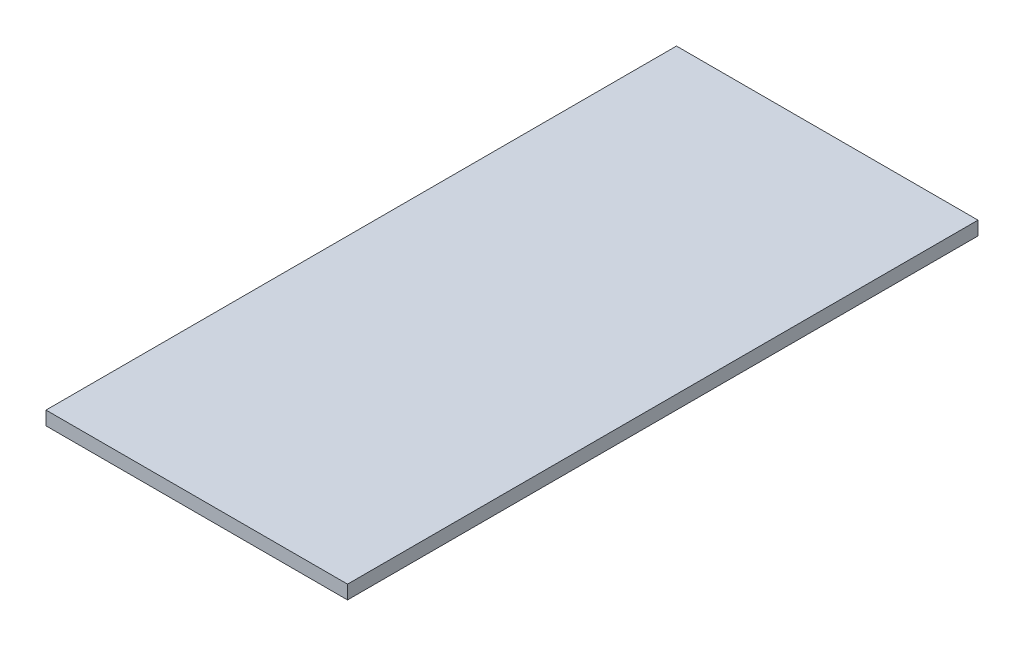
ISO-10303-21;
HEADER;
FILE_DESCRIPTION(('STEP AP214'),'2;1');
FILE_NAME('part.step','',(''),(''),'','','');
FILE_SCHEMA(('AUTOMOTIVE_DESIGN { 1 0 10303 214 1 1 1 1 }'));
ENDSEC;
DATA;
#1=APPLICATION_CONTEXT('core data for automotive mechanical design processes');
#2=APPLICATION_PROTOCOL_DEFINITION('international standard','automotive_design',2000,#1);
#3=PRODUCT_CONTEXT('',#1,'mechanical');
#4=PRODUCT('Part','Part','',(#3));
#5=PRODUCT_RELATED_PRODUCT_CATEGORY('part','',(#4));
#6=PRODUCT_DEFINITION_FORMATION('','',#4);
#7=PRODUCT_DEFINITION_CONTEXT('part definition',#1,'design');
#8=PRODUCT_DEFINITION('design','',#6,#7);
#9=PRODUCT_DEFINITION_SHAPE('','',#8);
#10=(LENGTH_UNIT() NAMED_UNIT(*) SI_UNIT(.MILLI.,.METRE.));
#11=(NAMED_UNIT(*) PLANE_ANGLE_UNIT() SI_UNIT($,.RADIAN.));
#12=(NAMED_UNIT(*) SI_UNIT($,.STERADIAN.) SOLID_ANGLE_UNIT());
#13=UNCERTAINTY_MEASURE_WITH_UNIT(LENGTH_MEASURE(1.E-05),#10,'distance_accuracy_value','');
#14=(GEOMETRIC_REPRESENTATION_CONTEXT(3) GLOBAL_UNCERTAINTY_ASSIGNED_CONTEXT((#13)) GLOBAL_UNIT_ASSIGNED_CONTEXT((#10,
#11,#12)) REPRESENTATION_CONTEXT('',''));
#15=CARTESIAN_POINT('',(0.,0.,0.));
#16=DIRECTION('',(0.,0.,1.));
#17=DIRECTION('',(1.,0.,0.));
#18=AXIS2_PLACEMENT_3D('',#15,#16,#17);
#19=CARTESIAN_POINT('',(139.7,12.7,0.));
#20=DIRECTION('',(1.,0.,0.));
#21=DIRECTION('',(0.,0.,-1.));
#22=AXIS2_PLACEMENT_3D('',#19,#20,#21);
#23=PLANE('',#22);
#24=DIRECTION('',(0.,0.,1.));
#25=VECTOR('',#24,1.);
#26=CARTESIAN_POINT('',(139.7,0.,0.));
#27=LINE('',#26,#25);
#28=CARTESIAN_POINT('',(139.7,0.,-292.1));
#29=VERTEX_POINT('',#28);
#30=CARTESIAN_POINT('',(139.7,0.,292.1));
#31=VERTEX_POINT('',#30);
#32=EDGE_CURVE('E106',#29,#31,#27,.T.);
#33=ORIENTED_EDGE('',*,*,#32,.F.);
#34=DIRECTION('',(0.,-1.,0.));
#35=VECTOR('',#34,1.);
#36=CARTESIAN_POINT('',(139.7,12.7,-292.1));
#37=LINE('',#36,#35);
#38=CARTESIAN_POINT('',(139.7,12.7,-292.1));
#39=VERTEX_POINT('',#38);
#40=EDGE_CURVE('E11',#39,#29,#37,.T.);
#41=ORIENTED_EDGE('',*,*,#40,.F.);
#42=DIRECTION('',(0.,0.,1.));
#43=VECTOR('',#42,1.);
#44=CARTESIAN_POINT('',(139.7,12.7,0.));
#45=LINE('',#44,#43);
#46=CARTESIAN_POINT('',(139.7,12.7,292.1));
#47=VERTEX_POINT('',#46);
#48=EDGE_CURVE('E100',#39,#47,#45,.T.);
#49=ORIENTED_EDGE('',*,*,#48,.T.);
#50=DIRECTION('',(0.,-1.,0.));
#51=VECTOR('',#50,1.);
#52=CARTESIAN_POINT('',(139.7,12.7,292.1));
#53=LINE('',#52,#51);
#54=EDGE_CURVE('E81',#47,#31,#53,.T.);
#55=ORIENTED_EDGE('',*,*,#54,.T.);
#56=EDGE_LOOP('',(#33,#41,#49,#55));
#57=FACE_BOUND('',#56,.T.);
#58=ADVANCED_FACE('F43',(#57),#23,.T.);
#59=CARTESIAN_POINT('',(0.,12.7,-292.1));
#60=DIRECTION('',(0.,0.,-1.));
#61=DIRECTION('',(-1.,0.,0.));
#62=AXIS2_PLACEMENT_3D('',#59,#60,#61);
#63=PLANE('',#62);
#64=DIRECTION('',(1.,0.,0.));
#65=VECTOR('',#64,1.);
#66=CARTESIAN_POINT('',(0.,0.,-292.1));
#67=LINE('',#66,#65);
#68=CARTESIAN_POINT('',(-139.7,0.,-292.1));
#69=VERTEX_POINT('',#68);
#70=EDGE_CURVE('E94',#69,#29,#67,.T.);
#71=ORIENTED_EDGE('',*,*,#70,.F.);
#72=DIRECTION('',(0.,-1.,0.));
#73=VECTOR('',#72,1.);
#74=CARTESIAN_POINT('',(-139.7,12.7,-292.1));
#75=LINE('',#74,#73);
#76=CARTESIAN_POINT('',(-139.7,12.7,-292.1));
#77=VERTEX_POINT('',#76);
#78=EDGE_CURVE('E51',#77,#69,#75,.T.);
#79=ORIENTED_EDGE('',*,*,#78,.F.);
#80=DIRECTION('',(1.,0.,0.));
#81=VECTOR('',#80,1.);
#82=CARTESIAN_POINT('',(0.,12.7,-292.1));
#83=LINE('',#82,#81);
#84=EDGE_CURVE('E92',#77,#39,#83,.T.);
#85=ORIENTED_EDGE('',*,*,#84,.T.);
#86=ORIENTED_EDGE('',*,*,#40,.T.);
#87=EDGE_LOOP('',(#71,#79,#85,#86));
#88=FACE_BOUND('',#87,.T.);
#89=ADVANCED_FACE('F90',(#88),#63,.T.);
#90=CARTESIAN_POINT('',(-139.7,12.7,0.));
#91=DIRECTION('',(1.,0.,0.));
#92=DIRECTION('',(0.,0.,-1.));
#93=AXIS2_PLACEMENT_3D('',#90,#91,#92);
#94=PLANE('',#93);
#95=DIRECTION('',(0.,0.,1.));
#96=VECTOR('',#95,1.);
#97=CARTESIAN_POINT('',(-139.7,0.,0.));
#98=LINE('',#97,#96);
#99=CARTESIAN_POINT('',(-139.7,0.,292.1));
#100=VERTEX_POINT('',#99);
#101=EDGE_CURVE('E74',#69,#100,#98,.T.);
#102=ORIENTED_EDGE('',*,*,#101,.T.);
#103=DIRECTION('',(0.,-1.,0.));
#104=VECTOR('',#103,1.);
#105=CARTESIAN_POINT('',(-139.7,12.7,292.1));
#106=LINE('',#105,#104);
#107=CARTESIAN_POINT('',(-139.7,12.7,292.1));
#108=VERTEX_POINT('',#107);
#109=EDGE_CURVE('E95',#108,#100,#106,.T.);
#110=ORIENTED_EDGE('',*,*,#109,.F.);
#111=DIRECTION('',(0.,0.,1.));
#112=VECTOR('',#111,1.);
#113=CARTESIAN_POINT('',(-139.7,12.7,0.));
#114=LINE('',#113,#112);
#115=EDGE_CURVE('E96',#77,#108,#114,.T.);
#116=ORIENTED_EDGE('',*,*,#115,.F.);
#117=ORIENTED_EDGE('',*,*,#78,.T.);
#118=EDGE_LOOP('',(#102,#110,#116,#117));
#119=FACE_BOUND('',#118,.T.);
#120=ADVANCED_FACE('F97',(#119),#94,.F.);
#121=CARTESIAN_POINT('',(0.,12.7,292.1));
#122=DIRECTION('',(0.,0.,-1.));
#123=DIRECTION('',(-1.,0.,0.));
#124=AXIS2_PLACEMENT_3D('',#121,#122,#123);
#125=PLANE('',#124);
#126=DIRECTION('',(1.,0.,0.));
#127=VECTOR('',#126,1.);
#128=CARTESIAN_POINT('',(0.,0.,292.1));
#129=LINE('',#128,#127);
#130=EDGE_CURVE('E102',#100,#31,#129,.T.);
#131=ORIENTED_EDGE('',*,*,#130,.T.);
#132=ORIENTED_EDGE('',*,*,#54,.F.);
#133=DIRECTION('',(1.,0.,0.));
#134=VECTOR('',#133,1.);
#135=CARTESIAN_POINT('',(0.,12.7,292.1));
#136=LINE('',#135,#134);
#137=EDGE_CURVE('E59',#108,#47,#136,.T.);
#138=ORIENTED_EDGE('',*,*,#137,.F.);
#139=ORIENTED_EDGE('',*,*,#109,.T.);
#140=EDGE_LOOP('',(#131,#132,#138,#139));
#141=FACE_BOUND('',#140,.T.);
#142=ADVANCED_FACE('F115',(#141),#125,.F.);
#143=CARTESIAN_POINT('',(0.,12.7,0.));
#144=DIRECTION('',(0.,1.,0.));
#145=DIRECTION('',(0.,0.,1.));
#146=AXIS2_PLACEMENT_3D('',#143,#144,#145);
#147=PLANE('',#146);
#148=ORIENTED_EDGE('',*,*,#48,.F.);
#149=ORIENTED_EDGE('',*,*,#84,.F.);
#150=ORIENTED_EDGE('',*,*,#115,.T.);
#151=ORIENTED_EDGE('',*,*,#137,.T.);
#152=EDGE_LOOP('',(#148,#149,#150,#151));
#153=FACE_BOUND('',#152,.T.);
#154=ADVANCED_FACE('F99',(#153),#147,.T.);
#155=CARTESIAN_POINT('',(0.,0.,0.));
#156=DIRECTION('',(0.,1.,0.));
#157=DIRECTION('',(0.,0.,1.));
#158=AXIS2_PLACEMENT_3D('',#155,#156,#157);
#159=PLANE('',#158);
#160=ORIENTED_EDGE('',*,*,#32,.T.);
#161=ORIENTED_EDGE('',*,*,#130,.F.);
#162=ORIENTED_EDGE('',*,*,#101,.F.);
#163=ORIENTED_EDGE('',*,*,#70,.T.);
#164=EDGE_LOOP('',(#160,#161,#162,#163));
#165=FACE_BOUND('',#164,.T.);
#166=ADVANCED_FACE('F117',(#165),#159,.F.);
#167=CLOSED_SHELL('',(#58,#89,#120,#142,#154,#166));
#168=MANIFOLD_SOLID_BREP('B2',#167);
#169=ADVANCED_BREP_SHAPE_REPRESENTATION('',(#18,#168),#14);
#170=SHAPE_DEFINITION_REPRESENTATION(#9,#169);
ENDSEC;
END-ISO-10303-21;
